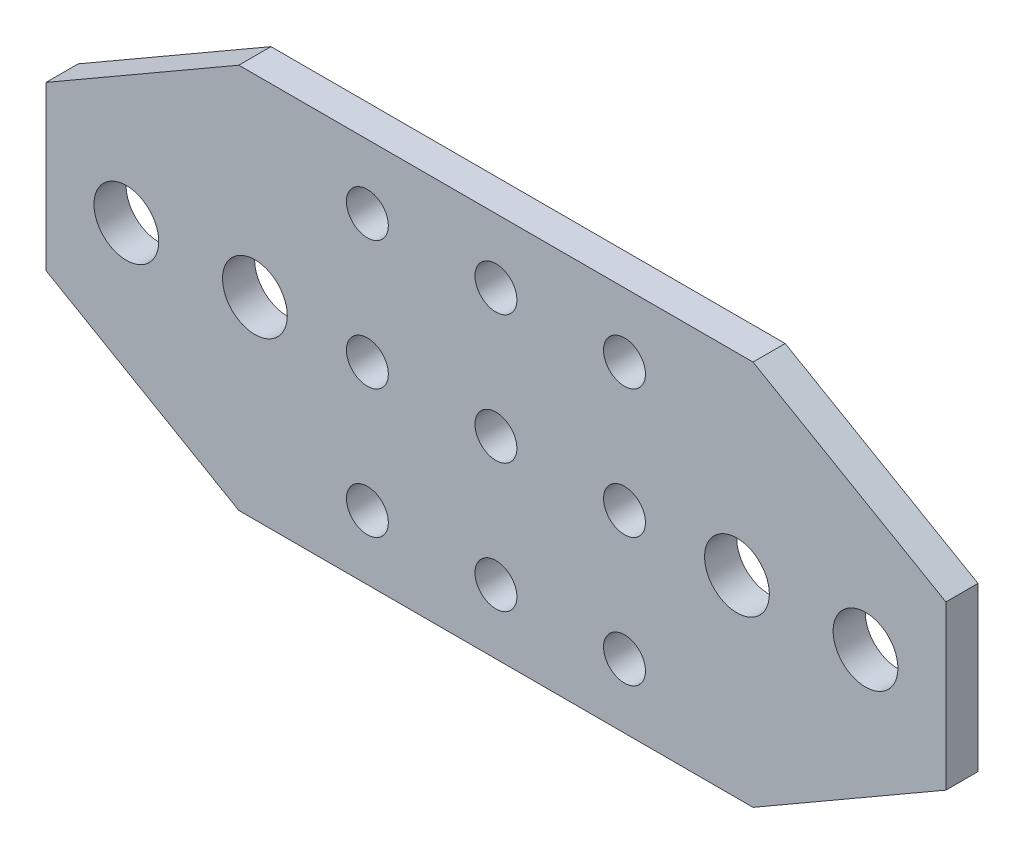
ISO-10303-21;
HEADER;
FILE_DESCRIPTION(('STEP AP214'),'2;1');
FILE_NAME('part.step','',(''),(''),'','','');
FILE_SCHEMA(('AUTOMOTIVE_DESIGN { 1 0 10303 214 1 1 1 1 }'));
ENDSEC;
DATA;
#1=APPLICATION_CONTEXT('core data for automotive mechanical design processes');
#2=APPLICATION_PROTOCOL_DEFINITION('international standard','automotive_design',2000,#1);
#3=PRODUCT_CONTEXT('',#1,'mechanical');
#4=PRODUCT('Part','Part','',(#3));
#5=PRODUCT_RELATED_PRODUCT_CATEGORY('part','',(#4));
#6=PRODUCT_DEFINITION_FORMATION('','',#4);
#7=PRODUCT_DEFINITION_CONTEXT('part definition',#1,'design');
#8=PRODUCT_DEFINITION('design','',#6,#7);
#9=PRODUCT_DEFINITION_SHAPE('','',#8);
#10=(LENGTH_UNIT() NAMED_UNIT(*) SI_UNIT(.MILLI.,.METRE.));
#11=(NAMED_UNIT(*) PLANE_ANGLE_UNIT() SI_UNIT($,.RADIAN.));
#12=(NAMED_UNIT(*) SI_UNIT($,.STERADIAN.) SOLID_ANGLE_UNIT());
#13=UNCERTAINTY_MEASURE_WITH_UNIT(LENGTH_MEASURE(1.E-05),#10,'distance_accuracy_value','');
#14=(GEOMETRIC_REPRESENTATION_CONTEXT(3) GLOBAL_UNCERTAINTY_ASSIGNED_CONTEXT((#13)) GLOBAL_UNIT_ASSIGNED_CONTEXT((#10,
#11,#12)) REPRESENTATION_CONTEXT('',''));
#15=CARTESIAN_POINT('',(0.,0.,0.));
#16=DIRECTION('',(0.,0.,1.));
#17=DIRECTION('',(1.,0.,0.));
#18=AXIS2_PLACEMENT_3D('',#15,#16,#17);
#19=CARTESIAN_POINT('',(-25.4,-19.05,3.175));
#20=DIRECTION('',(-0.499999999999995,-0.866025403784442,0.));
#21=DIRECTION('',(0.866025403784442,-0.499999999999995,0.));
#22=AXIS2_PLACEMENT_3D('',#19,#20,#21);
#23=PLANE('',#22);
#24=DIRECTION('',(-0.866025403784442,0.499999999999995,0.));
#25=VECTOR('',#24,1.);
#26=CARTESIAN_POINT('',(-25.4,-19.05,0.));
#27=LINE('',#26,#25);
#28=CARTESIAN_POINT('',(-25.4,-19.05,0.));
#29=VERTEX_POINT('',#28);
#30=CARTESIAN_POINT('',(-44.45,-8.05147737193778,0.));
#31=VERTEX_POINT('',#30);
#32=EDGE_CURVE('E132',#29,#31,#27,.T.);
#33=ORIENTED_EDGE('',*,*,#32,.F.);
#34=DIRECTION('',(0.,0.,-1.));
#35=VECTOR('',#34,1.);
#36=CARTESIAN_POINT('',(-25.4,-19.05,3.175));
#37=LINE('',#36,#35);
#38=CARTESIAN_POINT('',(-25.4,-19.05,3.175));
#39=VERTEX_POINT('',#38);
#40=EDGE_CURVE('E11',#39,#29,#37,.T.);
#41=ORIENTED_EDGE('',*,*,#40,.F.);
#42=DIRECTION('',(-0.866025403784442,0.499999999999995,0.));
#43=VECTOR('',#42,1.);
#44=CARTESIAN_POINT('',(-25.4,-19.05,3.175));
#45=LINE('',#44,#43);
#46=CARTESIAN_POINT('',(-44.45,-8.05147737193778,3.175));
#47=VERTEX_POINT('',#46);
#48=EDGE_CURVE('E153',#39,#47,#45,.T.);
#49=ORIENTED_EDGE('',*,*,#48,.T.);
#50=DIRECTION('',(0.,0.,-1.));
#51=VECTOR('',#50,1.);
#52=CARTESIAN_POINT('',(-44.45,-8.05147737193778,3.175));
#53=LINE('',#52,#51);
#54=EDGE_CURVE('E38',#47,#31,#53,.T.);
#55=ORIENTED_EDGE('',*,*,#54,.T.);
#56=EDGE_LOOP('',(#33,#41,#49,#55));
#57=FACE_BOUND('',#56,.T.);
#58=ADVANCED_FACE('F35',(#57),#23,.T.);
#59=CARTESIAN_POINT('',(25.4,-19.05,3.175));
#60=DIRECTION('',(0.,-1.,0.));
#61=DIRECTION('',(0.,0.,-1.));
#62=AXIS2_PLACEMENT_3D('',#59,#60,#61);
#63=PLANE('',#62);
#64=DIRECTION('',(-1.,0.,0.));
#65=VECTOR('',#64,1.);
#66=CARTESIAN_POINT('',(25.4,-19.05,0.));
#67=LINE('',#66,#65);
#68=CARTESIAN_POINT('',(25.4,-19.05,0.));
#69=VERTEX_POINT('',#68);
#70=EDGE_CURVE('E151',#69,#29,#67,.T.);
#71=ORIENTED_EDGE('',*,*,#70,.F.);
#72=DIRECTION('',(0.,0.,-1.));
#73=VECTOR('',#72,1.);
#74=CARTESIAN_POINT('',(25.4,-19.05,3.175));
#75=LINE('',#74,#73);
#76=CARTESIAN_POINT('',(25.4,-19.05,3.175));
#77=VERTEX_POINT('',#76);
#78=EDGE_CURVE('E44',#77,#69,#75,.T.);
#79=ORIENTED_EDGE('',*,*,#78,.F.);
#80=DIRECTION('',(-1.,0.,0.));
#81=VECTOR('',#80,1.);
#82=CARTESIAN_POINT('',(25.4,-19.05,3.175));
#83=LINE('',#82,#81);
#84=EDGE_CURVE('E122',#77,#39,#83,.T.);
#85=ORIENTED_EDGE('',*,*,#84,.T.);
#86=ORIENTED_EDGE('',*,*,#40,.T.);
#87=EDGE_LOOP('',(#71,#79,#85,#86));
#88=FACE_BOUND('',#87,.T.);
#89=ADVANCED_FACE('F165',(#88),#63,.T.);
#90=CARTESIAN_POINT('',(44.45,-8.05147737193777,3.175));
#91=DIRECTION('',(0.499999999999996,-0.866025403784441,0.));
#92=DIRECTION('',(0.866025403784441,0.499999999999996,0.));
#93=AXIS2_PLACEMENT_3D('',#90,#91,#92);
#94=PLANE('',#93);
#95=DIRECTION('',(-0.866025403784441,-0.499999999999996,0.));
#96=VECTOR('',#95,1.);
#97=CARTESIAN_POINT('',(44.45,-8.05147737193777,0.));
#98=LINE('',#97,#96);
#99=CARTESIAN_POINT('',(44.45,-8.05147737193777,0.));
#100=VERTEX_POINT('',#99);
#101=EDGE_CURVE('E109',#100,#69,#98,.T.);
#102=ORIENTED_EDGE('',*,*,#101,.F.);
#103=DIRECTION('',(0.,0.,-1.));
#104=VECTOR('',#103,1.);
#105=CARTESIAN_POINT('',(44.45,-8.05147737193777,3.175));
#106=LINE('',#105,#104);
#107=CARTESIAN_POINT('',(44.45,-8.05147737193777,3.175));
#108=VERTEX_POINT('',#107);
#109=EDGE_CURVE('E104',#108,#100,#106,.T.);
#110=ORIENTED_EDGE('',*,*,#109,.F.);
#111=DIRECTION('',(-0.866025403784441,-0.499999999999996,0.));
#112=VECTOR('',#111,1.);
#113=CARTESIAN_POINT('',(44.45,-8.05147737193777,3.175));
#114=LINE('',#113,#112);
#115=EDGE_CURVE('E107',#108,#77,#114,.T.);
#116=ORIENTED_EDGE('',*,*,#115,.T.);
#117=ORIENTED_EDGE('',*,*,#78,.T.);
#118=EDGE_LOOP('',(#102,#110,#116,#117));
#119=FACE_BOUND('',#118,.T.);
#120=ADVANCED_FACE('F106',(#119),#94,.T.);
#121=CARTESIAN_POINT('',(44.45,8.05147737193778,3.175));
#122=DIRECTION('',(1.,0.,0.));
#123=DIRECTION('',(0.,1.,0.));
#124=AXIS2_PLACEMENT_3D('',#121,#122,#123);
#125=PLANE('',#124);
#126=DIRECTION('',(0.,-1.,0.));
#127=VECTOR('',#126,1.);
#128=CARTESIAN_POINT('',(44.45,8.05147737193778,0.));
#129=LINE('',#128,#127);
#130=CARTESIAN_POINT('',(44.45,8.05147737193778,0.));
#131=VERTEX_POINT('',#130);
#132=EDGE_CURVE('E148',#131,#100,#129,.T.);
#133=ORIENTED_EDGE('',*,*,#132,.F.);
#134=DIRECTION('',(0.,0.,-1.));
#135=VECTOR('',#134,1.);
#136=CARTESIAN_POINT('',(44.45,8.05147737193778,3.175));
#137=LINE('',#136,#135);
#138=CARTESIAN_POINT('',(44.45,8.05147737193778,3.175));
#139=VERTEX_POINT('',#138);
#140=EDGE_CURVE('E114',#139,#131,#137,.T.);
#141=ORIENTED_EDGE('',*,*,#140,.F.);
#142=DIRECTION('',(0.,-1.,0.));
#143=VECTOR('',#142,1.);
#144=CARTESIAN_POINT('',(44.45,8.05147737193778,3.175));
#145=LINE('',#144,#143);
#146=EDGE_CURVE('E120',#139,#108,#145,.T.);
#147=ORIENTED_EDGE('',*,*,#146,.T.);
#148=ORIENTED_EDGE('',*,*,#109,.T.);
#149=EDGE_LOOP('',(#133,#141,#147,#148));
#150=FACE_BOUND('',#149,.T.);
#151=ADVANCED_FACE('F124',(#150),#125,.T.);
#152=CARTESIAN_POINT('',(25.4,19.05,3.175));
#153=DIRECTION('',(0.499999999999995,0.866025403784442,0.));
#154=DIRECTION('',(-0.866025403784442,0.499999999999995,0.));
#155=AXIS2_PLACEMENT_3D('',#152,#153,#154);
#156=PLANE('',#155);
#157=DIRECTION('',(0.866025403784442,-0.499999999999995,0.));
#158=VECTOR('',#157,1.);
#159=CARTESIAN_POINT('',(25.4,19.05,0.));
#160=LINE('',#159,#158);
#161=CARTESIAN_POINT('',(25.4,19.05,0.));
#162=VERTEX_POINT('',#161);
#163=EDGE_CURVE('E145',#162,#131,#160,.T.);
#164=ORIENTED_EDGE('',*,*,#163,.F.);
#165=DIRECTION('',(0.,0.,-1.));
#166=VECTOR('',#165,1.);
#167=CARTESIAN_POINT('',(25.4,19.05,3.175));
#168=LINE('',#167,#166);
#169=CARTESIAN_POINT('',(25.4,19.05,3.175));
#170=VERTEX_POINT('',#169);
#171=EDGE_CURVE('E157',#170,#162,#168,.T.);
#172=ORIENTED_EDGE('',*,*,#171,.F.);
#173=DIRECTION('',(0.866025403784442,-0.499999999999995,0.));
#174=VECTOR('',#173,1.);
#175=CARTESIAN_POINT('',(25.4,19.05,3.175));
#176=LINE('',#175,#174);
#177=EDGE_CURVE('E125',#170,#139,#176,.T.);
#178=ORIENTED_EDGE('',*,*,#177,.T.);
#179=ORIENTED_EDGE('',*,*,#140,.T.);
#180=EDGE_LOOP('',(#164,#172,#178,#179));
#181=FACE_BOUND('',#180,.T.);
#182=ADVANCED_FACE('F178',(#181),#156,.T.);
#183=CARTESIAN_POINT('',(-25.4,19.05,3.175));
#184=DIRECTION('',(0.,1.,0.));
#185=DIRECTION('',(0.,0.,1.));
#186=AXIS2_PLACEMENT_3D('',#183,#184,#185);
#187=PLANE('',#186);
#188=DIRECTION('',(1.,0.,0.));
#189=VECTOR('',#188,1.);
#190=CARTESIAN_POINT('',(-25.4,19.05,0.));
#191=LINE('',#190,#189);
#192=CARTESIAN_POINT('',(-25.4,19.05,0.));
#193=VERTEX_POINT('',#192);
#194=EDGE_CURVE('E142',#193,#162,#191,.T.);
#195=ORIENTED_EDGE('',*,*,#194,.F.);
#196=DIRECTION('',(0.,0.,-1.));
#197=VECTOR('',#196,1.);
#198=CARTESIAN_POINT('',(-25.4,19.05,3.175));
#199=LINE('',#198,#197);
#200=CARTESIAN_POINT('',(-25.4,19.05,3.175));
#201=VERTEX_POINT('',#200);
#202=EDGE_CURVE('E159',#201,#193,#199,.T.);
#203=ORIENTED_EDGE('',*,*,#202,.F.);
#204=DIRECTION('',(1.,0.,0.));
#205=VECTOR('',#204,1.);
#206=CARTESIAN_POINT('',(-25.4,19.05,3.175));
#207=LINE('',#206,#205);
#208=EDGE_CURVE('E127',#201,#170,#207,.T.);
#209=ORIENTED_EDGE('',*,*,#208,.T.);
#210=ORIENTED_EDGE('',*,*,#171,.T.);
#211=EDGE_LOOP('',(#195,#203,#209,#210));
#212=FACE_BOUND('',#211,.T.);
#213=ADVANCED_FACE('F181',(#212),#187,.T.);
#214=CARTESIAN_POINT('',(-44.45,8.05147737193778,3.175));
#215=DIRECTION('',(-0.499999999999995,0.866025403784442,0.));
#216=DIRECTION('',(-0.866025403784442,-0.499999999999995,0.));
#217=AXIS2_PLACEMENT_3D('',#214,#215,#216);
#218=PLANE('',#217);
#219=DIRECTION('',(0.866025403784442,0.499999999999995,0.));
#220=VECTOR('',#219,1.);
#221=CARTESIAN_POINT('',(-44.45,8.05147737193778,0.));
#222=LINE('',#221,#220);
#223=CARTESIAN_POINT('',(-44.45,8.05147737193778,0.));
#224=VERTEX_POINT('',#223);
#225=EDGE_CURVE('E139',#224,#193,#222,.T.);
#226=ORIENTED_EDGE('',*,*,#225,.F.);
#227=DIRECTION('',(0.,0.,-1.));
#228=VECTOR('',#227,1.);
#229=CARTESIAN_POINT('',(-44.45,8.05147737193778,3.175));
#230=LINE('',#229,#228);
#231=CARTESIAN_POINT('',(-44.45,8.05147737193778,3.175));
#232=VERTEX_POINT('',#231);
#233=EDGE_CURVE('E160',#232,#224,#230,.T.);
#234=ORIENTED_EDGE('',*,*,#233,.F.);
#235=DIRECTION('',(0.866025403784442,0.499999999999995,0.));
#236=VECTOR('',#235,1.);
#237=CARTESIAN_POINT('',(-44.45,8.05147737193778,3.175));
#238=LINE('',#237,#236);
#239=EDGE_CURVE('E337',#232,#201,#238,.T.);
#240=ORIENTED_EDGE('',*,*,#239,.T.);
#241=ORIENTED_EDGE('',*,*,#202,.T.);
#242=EDGE_LOOP('',(#226,#234,#240,#241));
#243=FACE_BOUND('',#242,.T.);
#244=ADVANCED_FACE('F185',(#243),#218,.T.);
#245=CARTESIAN_POINT('',(-44.45,-8.05147737193778,3.175));
#246=DIRECTION('',(-1.,0.,0.));
#247=DIRECTION('',(0.,-1.,0.));
#248=AXIS2_PLACEMENT_3D('',#245,#246,#247);
#249=PLANE('',#248);
#250=DIRECTION('',(0.,1.,0.));
#251=VECTOR('',#250,1.);
#252=CARTESIAN_POINT('',(-44.45,-8.05147737193778,0.));
#253=LINE('',#252,#251);
#254=EDGE_CURVE('E135',#31,#224,#253,.T.);
#255=ORIENTED_EDGE('',*,*,#254,.F.);
#256=ORIENTED_EDGE('',*,*,#54,.F.);
#257=DIRECTION('',(0.,1.,0.));
#258=VECTOR('',#257,1.);
#259=CARTESIAN_POINT('',(-44.45,-8.05147737193778,3.175));
#260=LINE('',#259,#258);
#261=EDGE_CURVE('E335',#47,#232,#260,.T.);
#262=ORIENTED_EDGE('',*,*,#261,.T.);
#263=ORIENTED_EDGE('',*,*,#233,.T.);
#264=EDGE_LOOP('',(#255,#256,#262,#263));
#265=FACE_BOUND('',#264,.T.);
#266=ADVANCED_FACE('F162',(#265),#249,.T.);
#267=CARTESIAN_POINT('',(0.,0.,3.175));
#268=DIRECTION('',(0.,0.,-1.));
#269=DIRECTION('',(-1.,0.,0.));
#270=AXIS2_PLACEMENT_3D('',#267,#268,#269);
#271=PLANE('',#270);
#272=CARTESIAN_POINT('',(23.8125,0.,3.175));
#273=DIRECTION('',(0.,0.,-1.));
#274=DIRECTION('',(1.,0.,0.));
#275=AXIS2_PLACEMENT_3D('',#272,#273,#274);
#276=CIRCLE('',#275,3.2004);
#277=CARTESIAN_POINT('',(27.0129,0.,3.175));
#278=VERTEX_POINT('',#277);
#279=EDGE_CURVE('E256',#278,#278,#276,.T.);
#280=ORIENTED_EDGE('',*,*,#279,.T.);
#281=EDGE_LOOP('',(#280));
#282=FACE_BOUND('',#281,.T.);
#283=CARTESIAN_POINT('',(12.7,0.,3.175));
#284=DIRECTION('',(0.,0.,-1.));
#285=DIRECTION('',(1.,0.,0.));
#286=AXIS2_PLACEMENT_3D('',#283,#284,#285);
#287=CIRCLE('',#286,2.0701);
#288=CARTESIAN_POINT('',(14.7701,0.,3.175));
#289=VERTEX_POINT('',#288);
#290=EDGE_CURVE('E264',#289,#289,#287,.T.);
#291=ORIENTED_EDGE('',*,*,#290,.T.);
#292=EDGE_LOOP('',(#291));
#293=FACE_BOUND('',#292,.T.);
#294=CARTESIAN_POINT('',(-12.7,0.,3.175));
#295=DIRECTION('',(0.,0.,-1.));
#296=DIRECTION('',(1.,0.,0.));
#297=AXIS2_PLACEMENT_3D('',#294,#295,#296);
#298=CIRCLE('',#297,2.0701);
#299=CARTESIAN_POINT('',(-10.6299,0.,3.175));
#300=VERTEX_POINT('',#299);
#301=EDGE_CURVE('E270',#300,#300,#298,.T.);
#302=ORIENTED_EDGE('',*,*,#301,.T.);
#303=EDGE_LOOP('',(#302));
#304=FACE_BOUND('',#303,.T.);
#305=CARTESIAN_POINT('',(36.5125,0.,3.175));
#306=DIRECTION('',(0.,0.,-1.));
#307=DIRECTION('',(1.,0.,0.));
#308=AXIS2_PLACEMENT_3D('',#305,#306,#307);
#309=CIRCLE('',#308,3.2004);
#310=CARTESIAN_POINT('',(39.7129,0.,3.175));
#311=VERTEX_POINT('',#310);
#312=EDGE_CURVE('E276',#311,#311,#309,.T.);
#313=ORIENTED_EDGE('',*,*,#312,.T.);
#314=EDGE_LOOP('',(#313));
#315=FACE_BOUND('',#314,.T.);
#316=CARTESIAN_POINT('',(12.7,12.7,3.175));
#317=DIRECTION('',(0.,0.,-1.));
#318=DIRECTION('',(1.,0.,0.));
#319=AXIS2_PLACEMENT_3D('',#316,#317,#318);
#320=CIRCLE('',#319,2.0701);
#321=CARTESIAN_POINT('',(14.7701,12.7,3.175));
#322=VERTEX_POINT('',#321);
#323=EDGE_CURVE('E282',#322,#322,#320,.T.);
#324=ORIENTED_EDGE('',*,*,#323,.T.);
#325=EDGE_LOOP('',(#324));
#326=FACE_BOUND('',#325,.T.);
#327=CARTESIAN_POINT('',(-12.7,-12.7,3.175));
#328=DIRECTION('',(0.,0.,-1.));
#329=DIRECTION('',(1.,0.,0.));
#330=AXIS2_PLACEMENT_3D('',#327,#328,#329);
#331=CIRCLE('',#330,2.0701);
#332=CARTESIAN_POINT('',(-10.6299,-12.7,3.175));
#333=VERTEX_POINT('',#332);
#334=EDGE_CURVE('E288',#333,#333,#331,.T.);
#335=ORIENTED_EDGE('',*,*,#334,.T.);
#336=EDGE_LOOP('',(#335));
#337=FACE_BOUND('',#336,.T.);
#338=CARTESIAN_POINT('',(-12.7,12.7,3.175));
#339=DIRECTION('',(0.,0.,-1.));
#340=DIRECTION('',(1.,0.,0.));
#341=AXIS2_PLACEMENT_3D('',#338,#339,#340);
#342=CIRCLE('',#341,2.0701);
#343=CARTESIAN_POINT('',(-10.6299,12.7,3.175));
#344=VERTEX_POINT('',#343);
#345=EDGE_CURVE('E294',#344,#344,#342,.T.);
#346=ORIENTED_EDGE('',*,*,#345,.T.);
#347=EDGE_LOOP('',(#346));
#348=FACE_BOUND('',#347,.T.);
#349=CARTESIAN_POINT('',(12.7,-12.7,3.175));
#350=DIRECTION('',(0.,0.,-1.));
#351=DIRECTION('',(1.,0.,0.));
#352=AXIS2_PLACEMENT_3D('',#349,#350,#351);
#353=CIRCLE('',#352,2.0701);
#354=CARTESIAN_POINT('',(14.7701,-12.7,3.175));
#355=VERTEX_POINT('',#354);
#356=EDGE_CURVE('E300',#355,#355,#353,.T.);
#357=ORIENTED_EDGE('',*,*,#356,.T.);
#358=EDGE_LOOP('',(#357));
#359=FACE_BOUND('',#358,.T.);
#360=CARTESIAN_POINT('',(-36.5125,0.,3.175));
#361=DIRECTION('',(0.,0.,-1.));
#362=DIRECTION('',(1.,0.,0.));
#363=AXIS2_PLACEMENT_3D('',#360,#361,#362);
#364=CIRCLE('',#363,3.2004);
#365=CARTESIAN_POINT('',(-33.3121,0.,3.175));
#366=VERTEX_POINT('',#365);
#367=EDGE_CURVE('E306',#366,#366,#364,.T.);
#368=ORIENTED_EDGE('',*,*,#367,.T.);
#369=EDGE_LOOP('',(#368));
#370=FACE_BOUND('',#369,.T.);
#371=CARTESIAN_POINT('',(0.,0.,3.175));
#372=DIRECTION('',(0.,0.,-1.));
#373=DIRECTION('',(1.,0.,0.));
#374=AXIS2_PLACEMENT_3D('',#371,#372,#373);
#375=CIRCLE('',#374,2.0701);
#376=CARTESIAN_POINT('',(2.0701,0.,3.175));
#377=VERTEX_POINT('',#376);
#378=EDGE_CURVE('E312',#377,#377,#375,.T.);
#379=ORIENTED_EDGE('',*,*,#378,.T.);
#380=EDGE_LOOP('',(#379));
#381=FACE_BOUND('',#380,.T.);
#382=CARTESIAN_POINT('',(0.,12.7,3.175));
#383=DIRECTION('',(0.,0.,-1.));
#384=DIRECTION('',(1.,0.,0.));
#385=AXIS2_PLACEMENT_3D('',#382,#383,#384);
#386=CIRCLE('',#385,2.0701);
#387=CARTESIAN_POINT('',(2.07009999999999,12.7,3.175));
#388=VERTEX_POINT('',#387);
#389=EDGE_CURVE('E318',#388,#388,#386,.T.);
#390=ORIENTED_EDGE('',*,*,#389,.T.);
#391=EDGE_LOOP('',(#390));
#392=FACE_BOUND('',#391,.T.);
#393=CARTESIAN_POINT('',(0.,-12.7,3.175));
#394=DIRECTION('',(0.,0.,-1.));
#395=DIRECTION('',(1.,0.,0.));
#396=AXIS2_PLACEMENT_3D('',#393,#394,#395);
#397=CIRCLE('',#396,2.0701);
#398=CARTESIAN_POINT('',(2.07009999999999,-12.7,3.175));
#399=VERTEX_POINT('',#398);
#400=EDGE_CURVE('E324',#399,#399,#397,.T.);
#401=ORIENTED_EDGE('',*,*,#400,.T.);
#402=EDGE_LOOP('',(#401));
#403=FACE_BOUND('',#402,.T.);
#404=CARTESIAN_POINT('',(-23.8125,0.,3.175));
#405=DIRECTION('',(0.,0.,-1.));
#406=DIRECTION('',(1.,0.,0.));
#407=AXIS2_PLACEMENT_3D('',#404,#405,#406);
#408=CIRCLE('',#407,3.2004);
#409=CARTESIAN_POINT('',(-20.6121,0.,3.175));
#410=VERTEX_POINT('',#409);
#411=EDGE_CURVE('E136',#410,#410,#408,.T.);
#412=ORIENTED_EDGE('',*,*,#411,.T.);
#413=EDGE_LOOP('',(#412));
#414=FACE_BOUND('',#413,.T.);
#415=ORIENTED_EDGE('',*,*,#48,.F.);
#416=ORIENTED_EDGE('',*,*,#84,.F.);
#417=ORIENTED_EDGE('',*,*,#115,.F.);
#418=ORIENTED_EDGE('',*,*,#146,.F.);
#419=ORIENTED_EDGE('',*,*,#177,.F.);
#420=ORIENTED_EDGE('',*,*,#208,.F.);
#421=ORIENTED_EDGE('',*,*,#239,.F.);
#422=ORIENTED_EDGE('',*,*,#261,.F.);
#423=EDGE_LOOP('',(#415,#416,#417,#418,#419,#420,#421,#422));
#424=FACE_BOUND('',#423,.T.);
#425=ADVANCED_FACE('F118',(#282,#293,#304,#315,#326,#337,#348,#359,#370,#381,#392,#403,#414,
#424),#271,.F.);
#426=CARTESIAN_POINT('',(0.,0.,0.));
#427=DIRECTION('',(0.,0.,-1.));
#428=DIRECTION('',(-1.,0.,0.));
#429=AXIS2_PLACEMENT_3D('',#426,#427,#428);
#430=PLANE('',#429);
#431=CARTESIAN_POINT('',(23.8125,0.,0.));
#432=DIRECTION('',(0.,0.,-1.));
#433=DIRECTION('',(1.,0.,0.));
#434=AXIS2_PLACEMENT_3D('',#431,#432,#433);
#435=CIRCLE('',#434,3.2004);
#436=CARTESIAN_POINT('',(27.0129,0.,0.));
#437=VERTEX_POINT('',#436);
#438=EDGE_CURVE('E259',#437,#437,#435,.T.);
#439=ORIENTED_EDGE('',*,*,#438,.F.);
#440=EDGE_LOOP('',(#439));
#441=FACE_BOUND('',#440,.T.);
#442=CARTESIAN_POINT('',(12.7,0.,0.));
#443=DIRECTION('',(0.,0.,-1.));
#444=DIRECTION('',(1.,0.,0.));
#445=AXIS2_PLACEMENT_3D('',#442,#443,#444);
#446=CIRCLE('',#445,2.0701);
#447=CARTESIAN_POINT('',(14.7701,0.,0.));
#448=VERTEX_POINT('',#447);
#449=EDGE_CURVE('E261',#448,#448,#446,.T.);
#450=ORIENTED_EDGE('',*,*,#449,.F.);
#451=EDGE_LOOP('',(#450));
#452=FACE_BOUND('',#451,.T.);
#453=CARTESIAN_POINT('',(-12.7,0.,0.));
#454=DIRECTION('',(0.,0.,-1.));
#455=DIRECTION('',(1.,0.,0.));
#456=AXIS2_PLACEMENT_3D('',#453,#454,#455);
#457=CIRCLE('',#456,2.0701);
#458=CARTESIAN_POINT('',(-10.6299,0.,0.));
#459=VERTEX_POINT('',#458);
#460=EDGE_CURVE('E267',#459,#459,#457,.T.);
#461=ORIENTED_EDGE('',*,*,#460,.F.);
#462=EDGE_LOOP('',(#461));
#463=FACE_BOUND('',#462,.T.);
#464=CARTESIAN_POINT('',(36.5125,0.,0.));
#465=DIRECTION('',(0.,0.,-1.));
#466=DIRECTION('',(1.,0.,0.));
#467=AXIS2_PLACEMENT_3D('',#464,#465,#466);
#468=CIRCLE('',#467,3.2004);
#469=CARTESIAN_POINT('',(39.7129,0.,0.));
#470=VERTEX_POINT('',#469);
#471=EDGE_CURVE('E273',#470,#470,#468,.T.);
#472=ORIENTED_EDGE('',*,*,#471,.F.);
#473=EDGE_LOOP('',(#472));
#474=FACE_BOUND('',#473,.T.);
#475=CARTESIAN_POINT('',(12.7,12.7,0.));
#476=DIRECTION('',(0.,0.,-1.));
#477=DIRECTION('',(1.,0.,0.));
#478=AXIS2_PLACEMENT_3D('',#475,#476,#477);
#479=CIRCLE('',#478,2.0701);
#480=CARTESIAN_POINT('',(14.7701,12.7,0.));
#481=VERTEX_POINT('',#480);
#482=EDGE_CURVE('E279',#481,#481,#479,.T.);
#483=ORIENTED_EDGE('',*,*,#482,.F.);
#484=EDGE_LOOP('',(#483));
#485=FACE_BOUND('',#484,.T.);
#486=CARTESIAN_POINT('',(-12.7,-12.7,0.));
#487=DIRECTION('',(0.,0.,-1.));
#488=DIRECTION('',(1.,0.,0.));
#489=AXIS2_PLACEMENT_3D('',#486,#487,#488);
#490=CIRCLE('',#489,2.0701);
#491=CARTESIAN_POINT('',(-10.6299,-12.7,0.));
#492=VERTEX_POINT('',#491);
#493=EDGE_CURVE('E285',#492,#492,#490,.T.);
#494=ORIENTED_EDGE('',*,*,#493,.F.);
#495=EDGE_LOOP('',(#494));
#496=FACE_BOUND('',#495,.T.);
#497=CARTESIAN_POINT('',(-12.7,12.7,0.));
#498=DIRECTION('',(0.,0.,-1.));
#499=DIRECTION('',(1.,0.,0.));
#500=AXIS2_PLACEMENT_3D('',#497,#498,#499);
#501=CIRCLE('',#500,2.0701);
#502=CARTESIAN_POINT('',(-10.6299,12.7,0.));
#503=VERTEX_POINT('',#502);
#504=EDGE_CURVE('E291',#503,#503,#501,.T.);
#505=ORIENTED_EDGE('',*,*,#504,.F.);
#506=EDGE_LOOP('',(#505));
#507=FACE_BOUND('',#506,.T.);
#508=CARTESIAN_POINT('',(12.7,-12.7,0.));
#509=DIRECTION('',(0.,0.,-1.));
#510=DIRECTION('',(1.,0.,0.));
#511=AXIS2_PLACEMENT_3D('',#508,#509,#510);
#512=CIRCLE('',#511,2.0701);
#513=CARTESIAN_POINT('',(14.7701,-12.7,0.));
#514=VERTEX_POINT('',#513);
#515=EDGE_CURVE('E297',#514,#514,#512,.T.);
#516=ORIENTED_EDGE('',*,*,#515,.F.);
#517=EDGE_LOOP('',(#516));
#518=FACE_BOUND('',#517,.T.);
#519=CARTESIAN_POINT('',(-36.5125,0.,0.));
#520=DIRECTION('',(0.,0.,-1.));
#521=DIRECTION('',(1.,0.,0.));
#522=AXIS2_PLACEMENT_3D('',#519,#520,#521);
#523=CIRCLE('',#522,3.2004);
#524=CARTESIAN_POINT('',(-33.3121,0.,0.));
#525=VERTEX_POINT('',#524);
#526=EDGE_CURVE('E303',#525,#525,#523,.T.);
#527=ORIENTED_EDGE('',*,*,#526,.F.);
#528=EDGE_LOOP('',(#527));
#529=FACE_BOUND('',#528,.T.);
#530=CARTESIAN_POINT('',(0.,0.,0.));
#531=DIRECTION('',(0.,0.,-1.));
#532=DIRECTION('',(1.,0.,0.));
#533=AXIS2_PLACEMENT_3D('',#530,#531,#532);
#534=CIRCLE('',#533,2.0701);
#535=CARTESIAN_POINT('',(2.0701,0.,0.));
#536=VERTEX_POINT('',#535);
#537=EDGE_CURVE('E309',#536,#536,#534,.T.);
#538=ORIENTED_EDGE('',*,*,#537,.F.);
#539=EDGE_LOOP('',(#538));
#540=FACE_BOUND('',#539,.T.);
#541=CARTESIAN_POINT('',(0.,12.7,0.));
#542=DIRECTION('',(0.,0.,-1.));
#543=DIRECTION('',(1.,0.,0.));
#544=AXIS2_PLACEMENT_3D('',#541,#542,#543);
#545=CIRCLE('',#544,2.0701);
#546=CARTESIAN_POINT('',(2.07009999999999,12.7,0.));
#547=VERTEX_POINT('',#546);
#548=EDGE_CURVE('E315',#547,#547,#545,.T.);
#549=ORIENTED_EDGE('',*,*,#548,.F.);
#550=EDGE_LOOP('',(#549));
#551=FACE_BOUND('',#550,.T.);
#552=CARTESIAN_POINT('',(0.,-12.7,0.));
#553=DIRECTION('',(0.,0.,-1.));
#554=DIRECTION('',(1.,0.,0.));
#555=AXIS2_PLACEMENT_3D('',#552,#553,#554);
#556=CIRCLE('',#555,2.0701);
#557=CARTESIAN_POINT('',(2.07009999999999,-12.7,0.));
#558=VERTEX_POINT('',#557);
#559=EDGE_CURVE('E321',#558,#558,#556,.T.);
#560=ORIENTED_EDGE('',*,*,#559,.F.);
#561=EDGE_LOOP('',(#560));
#562=FACE_BOUND('',#561,.T.);
#563=CARTESIAN_POINT('',(-23.8125,0.,0.));
#564=DIRECTION('',(0.,0.,-1.));
#565=DIRECTION('',(1.,0.,0.));
#566=AXIS2_PLACEMENT_3D('',#563,#564,#565);
#567=CIRCLE('',#566,3.2004);
#568=CARTESIAN_POINT('',(-20.6121,0.,0.));
#569=VERTEX_POINT('',#568);
#570=EDGE_CURVE('E327',#569,#569,#567,.T.);
#571=ORIENTED_EDGE('',*,*,#570,.F.);
#572=EDGE_LOOP('',(#571));
#573=FACE_BOUND('',#572,.T.);
#574=ORIENTED_EDGE('',*,*,#32,.T.);
#575=ORIENTED_EDGE('',*,*,#254,.T.);
#576=ORIENTED_EDGE('',*,*,#225,.T.);
#577=ORIENTED_EDGE('',*,*,#194,.T.);
#578=ORIENTED_EDGE('',*,*,#163,.T.);
#579=ORIENTED_EDGE('',*,*,#132,.T.);
#580=ORIENTED_EDGE('',*,*,#101,.T.);
#581=ORIENTED_EDGE('',*,*,#70,.T.);
#582=EDGE_LOOP('',(#574,#575,#576,#577,#578,#579,#580,#581));
#583=FACE_BOUND('',#582,.T.);
#584=ADVANCED_FACE('F164',(#441,#452,#463,#474,#485,#496,#507,#518,#529,#540,#551,#562,#573,
#583),#430,.T.);
#585=CARTESIAN_POINT('',(-23.8125,0.,3.175));
#586=DIRECTION('',(0.,0.,-1.));
#587=DIRECTION('',(-1.,0.,0.));
#588=AXIS2_PLACEMENT_3D('',#585,#586,#587);
#589=CYLINDRICAL_SURFACE('',#588,3.2004);
#590=ORIENTED_EDGE('',*,*,#411,.F.);
#591=EDGE_LOOP('',(#590));
#592=FACE_BOUND('',#591,.T.);
#593=ORIENTED_EDGE('',*,*,#570,.T.);
#594=EDGE_LOOP('',(#593));
#595=FACE_BOUND('',#594,.T.);
#596=ADVANCED_FACE('F197',(#592,#595),#589,.F.);
#597=CARTESIAN_POINT('',(0.,-12.7,3.175));
#598=DIRECTION('',(0.,0.,-1.));
#599=DIRECTION('',(-1.,0.,0.));
#600=AXIS2_PLACEMENT_3D('',#597,#598,#599);
#601=CYLINDRICAL_SURFACE('',#600,2.0701);
#602=ORIENTED_EDGE('',*,*,#400,.F.);
#603=EDGE_LOOP('',(#602));
#604=FACE_BOUND('',#603,.T.);
#605=ORIENTED_EDGE('',*,*,#559,.T.);
#606=EDGE_LOOP('',(#605));
#607=FACE_BOUND('',#606,.T.);
#608=ADVANCED_FACE('F204',(#604,#607),#601,.F.);
#609=CARTESIAN_POINT('',(0.,12.7,3.175));
#610=DIRECTION('',(0.,0.,-1.));
#611=DIRECTION('',(-1.,0.,0.));
#612=AXIS2_PLACEMENT_3D('',#609,#610,#611);
#613=CYLINDRICAL_SURFACE('',#612,2.0701);
#614=ORIENTED_EDGE('',*,*,#389,.F.);
#615=EDGE_LOOP('',(#614));
#616=FACE_BOUND('',#615,.T.);
#617=ORIENTED_EDGE('',*,*,#548,.T.);
#618=EDGE_LOOP('',(#617));
#619=FACE_BOUND('',#618,.T.);
#620=ADVANCED_FACE('F208',(#616,#619),#613,.F.);
#621=CARTESIAN_POINT('',(0.,0.,3.175));
#622=DIRECTION('',(0.,0.,-1.));
#623=DIRECTION('',(-1.,0.,0.));
#624=AXIS2_PLACEMENT_3D('',#621,#622,#623);
#625=CYLINDRICAL_SURFACE('',#624,2.0701);
#626=ORIENTED_EDGE('',*,*,#378,.F.);
#627=EDGE_LOOP('',(#626));
#628=FACE_BOUND('',#627,.T.);
#629=ORIENTED_EDGE('',*,*,#537,.T.);
#630=EDGE_LOOP('',(#629));
#631=FACE_BOUND('',#630,.T.);
#632=ADVANCED_FACE('F212',(#628,#631),#625,.F.);
#633=CARTESIAN_POINT('',(-36.5125,0.,3.175));
#634=DIRECTION('',(0.,0.,-1.));
#635=DIRECTION('',(-1.,0.,0.));
#636=AXIS2_PLACEMENT_3D('',#633,#634,#635);
#637=CYLINDRICAL_SURFACE('',#636,3.2004);
#638=ORIENTED_EDGE('',*,*,#367,.F.);
#639=EDGE_LOOP('',(#638));
#640=FACE_BOUND('',#639,.T.);
#641=ORIENTED_EDGE('',*,*,#526,.T.);
#642=EDGE_LOOP('',(#641));
#643=FACE_BOUND('',#642,.T.);
#644=ADVANCED_FACE('F216',(#640,#643),#637,.F.);
#645=CARTESIAN_POINT('',(12.7,-12.7,3.175));
#646=DIRECTION('',(0.,0.,-1.));
#647=DIRECTION('',(-1.,0.,0.));
#648=AXIS2_PLACEMENT_3D('',#645,#646,#647);
#649=CYLINDRICAL_SURFACE('',#648,2.0701);
#650=ORIENTED_EDGE('',*,*,#356,.F.);
#651=EDGE_LOOP('',(#650));
#652=FACE_BOUND('',#651,.T.);
#653=ORIENTED_EDGE('',*,*,#515,.T.);
#654=EDGE_LOOP('',(#653));
#655=FACE_BOUND('',#654,.T.);
#656=ADVANCED_FACE('F220',(#652,#655),#649,.F.);
#657=CARTESIAN_POINT('',(-12.7,12.7,3.175));
#658=DIRECTION('',(0.,0.,-1.));
#659=DIRECTION('',(-1.,0.,0.));
#660=AXIS2_PLACEMENT_3D('',#657,#658,#659);
#661=CYLINDRICAL_SURFACE('',#660,2.0701);
#662=ORIENTED_EDGE('',*,*,#345,.F.);
#663=EDGE_LOOP('',(#662));
#664=FACE_BOUND('',#663,.T.);
#665=ORIENTED_EDGE('',*,*,#504,.T.);
#666=EDGE_LOOP('',(#665));
#667=FACE_BOUND('',#666,.T.);
#668=ADVANCED_FACE('F224',(#664,#667),#661,.F.);
#669=CARTESIAN_POINT('',(-12.7,-12.7,3.175));
#670=DIRECTION('',(0.,0.,-1.));
#671=DIRECTION('',(-1.,0.,0.));
#672=AXIS2_PLACEMENT_3D('',#669,#670,#671);
#673=CYLINDRICAL_SURFACE('',#672,2.0701);
#674=ORIENTED_EDGE('',*,*,#334,.F.);
#675=EDGE_LOOP('',(#674));
#676=FACE_BOUND('',#675,.T.);
#677=ORIENTED_EDGE('',*,*,#493,.T.);
#678=EDGE_LOOP('',(#677));
#679=FACE_BOUND('',#678,.T.);
#680=ADVANCED_FACE('F228',(#676,#679),#673,.F.);
#681=CARTESIAN_POINT('',(12.7,12.7,3.175));
#682=DIRECTION('',(0.,0.,-1.));
#683=DIRECTION('',(-1.,0.,0.));
#684=AXIS2_PLACEMENT_3D('',#681,#682,#683);
#685=CYLINDRICAL_SURFACE('',#684,2.0701);
#686=ORIENTED_EDGE('',*,*,#323,.F.);
#687=EDGE_LOOP('',(#686));
#688=FACE_BOUND('',#687,.T.);
#689=ORIENTED_EDGE('',*,*,#482,.T.);
#690=EDGE_LOOP('',(#689));
#691=FACE_BOUND('',#690,.T.);
#692=ADVANCED_FACE('F232',(#688,#691),#685,.F.);
#693=CARTESIAN_POINT('',(36.5125,0.,3.175));
#694=DIRECTION('',(0.,0.,-1.));
#695=DIRECTION('',(-1.,0.,0.));
#696=AXIS2_PLACEMENT_3D('',#693,#694,#695);
#697=CYLINDRICAL_SURFACE('',#696,3.2004);
#698=ORIENTED_EDGE('',*,*,#312,.F.);
#699=EDGE_LOOP('',(#698));
#700=FACE_BOUND('',#699,.T.);
#701=ORIENTED_EDGE('',*,*,#471,.T.);
#702=EDGE_LOOP('',(#701));
#703=FACE_BOUND('',#702,.T.);
#704=ADVANCED_FACE('F236',(#700,#703),#697,.F.);
#705=CARTESIAN_POINT('',(-12.7,0.,3.175));
#706=DIRECTION('',(0.,0.,-1.));
#707=DIRECTION('',(-1.,0.,0.));
#708=AXIS2_PLACEMENT_3D('',#705,#706,#707);
#709=CYLINDRICAL_SURFACE('',#708,2.0701);
#710=ORIENTED_EDGE('',*,*,#301,.F.);
#711=EDGE_LOOP('',(#710));
#712=FACE_BOUND('',#711,.T.);
#713=ORIENTED_EDGE('',*,*,#460,.T.);
#714=EDGE_LOOP('',(#713));
#715=FACE_BOUND('',#714,.T.);
#716=ADVANCED_FACE('F240',(#712,#715),#709,.F.);
#717=CARTESIAN_POINT('',(12.7,0.,3.175));
#718=DIRECTION('',(0.,0.,-1.));
#719=DIRECTION('',(-1.,0.,0.));
#720=AXIS2_PLACEMENT_3D('',#717,#718,#719);
#721=CYLINDRICAL_SURFACE('',#720,2.0701);
#722=ORIENTED_EDGE('',*,*,#290,.F.);
#723=EDGE_LOOP('',(#722));
#724=FACE_BOUND('',#723,.T.);
#725=ORIENTED_EDGE('',*,*,#449,.T.);
#726=EDGE_LOOP('',(#725));
#727=FACE_BOUND('',#726,.T.);
#728=ADVANCED_FACE('F244',(#724,#727),#721,.F.);
#729=CARTESIAN_POINT('',(23.8125,0.,3.175));
#730=DIRECTION('',(0.,0.,-1.));
#731=DIRECTION('',(-1.,0.,0.));
#732=AXIS2_PLACEMENT_3D('',#729,#730,#731);
#733=CYLINDRICAL_SURFACE('',#732,3.2004);
#734=ORIENTED_EDGE('',*,*,#279,.F.);
#735=EDGE_LOOP('',(#734));
#736=FACE_BOUND('',#735,.T.);
#737=ORIENTED_EDGE('',*,*,#438,.T.);
#738=EDGE_LOOP('',(#737));
#739=FACE_BOUND('',#738,.T.);
#740=ADVANCED_FACE('F248',(#736,#739),#733,.F.);
#741=CLOSED_SHELL('',(#58,#89,#120,#151,#182,#213,#244,#266,#425,#584,#596,#608,#620,#632,#644,
#656,#668,#680,#692,#704,#716,#728,#740));
#742=MANIFOLD_SOLID_BREP('B2',#741);
#743=ADVANCED_BREP_SHAPE_REPRESENTATION('',(#18,#742),#14);
#744=SHAPE_DEFINITION_REPRESENTATION(#9,#743);
ENDSEC;
END-ISO-10303-21;
